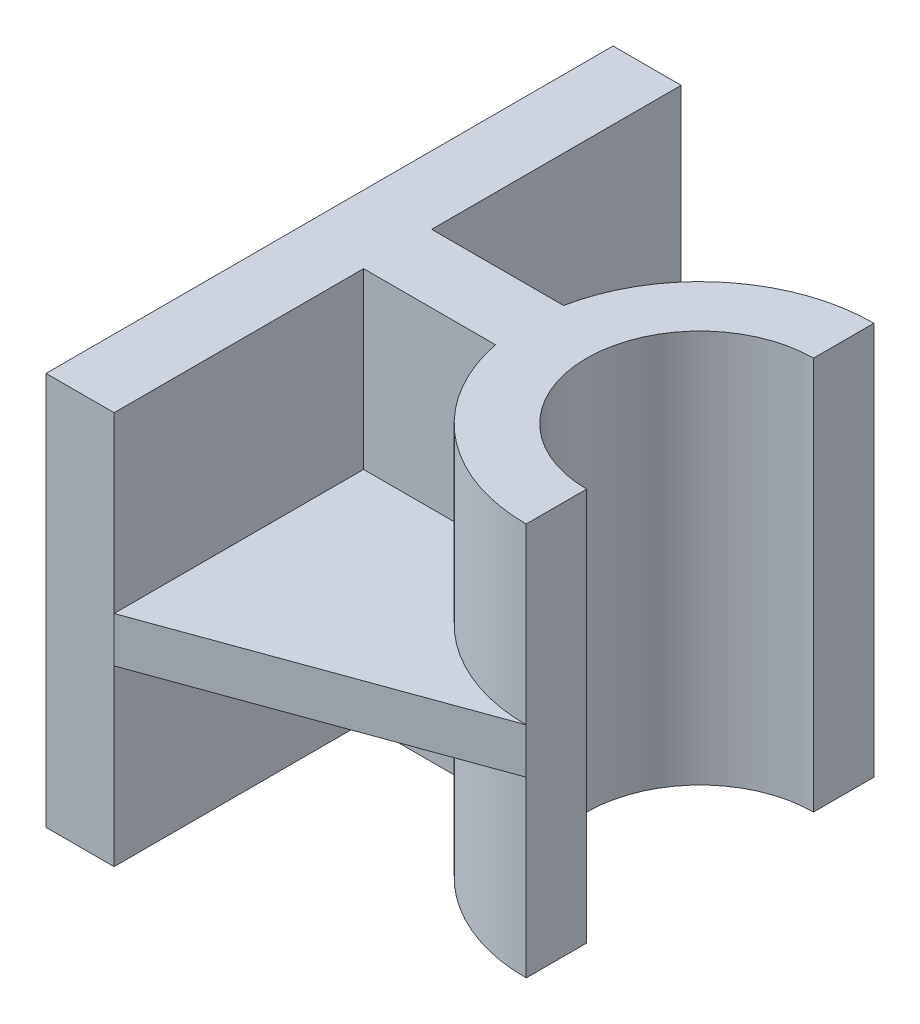
ISO-10303-21;
HEADER;
FILE_DESCRIPTION(('STEP AP214'),'2;1');
FILE_NAME('part.step','',(''),(''),'','','');
FILE_SCHEMA(('AUTOMOTIVE_DESIGN { 1 0 10303 214 1 1 1 1 }'));
ENDSEC;
DATA;
#1=APPLICATION_CONTEXT('core data for automotive mechanical design processes');
#2=APPLICATION_PROTOCOL_DEFINITION('international standard','automotive_design',2000,#1);
#3=PRODUCT_CONTEXT('',#1,'mechanical');
#4=PRODUCT('Part','Part','',(#3));
#5=PRODUCT_RELATED_PRODUCT_CATEGORY('part','',(#4));
#6=PRODUCT_DEFINITION_FORMATION('','',#4);
#7=PRODUCT_DEFINITION_CONTEXT('part definition',#1,'design');
#8=PRODUCT_DEFINITION('design','',#6,#7);
#9=PRODUCT_DEFINITION_SHAPE('','',#8);
#10=(LENGTH_UNIT() NAMED_UNIT(*) SI_UNIT(.MILLI.,.METRE.));
#11=(NAMED_UNIT(*) PLANE_ANGLE_UNIT() SI_UNIT($,.RADIAN.));
#12=(NAMED_UNIT(*) SI_UNIT($,.STERADIAN.) SOLID_ANGLE_UNIT());
#13=UNCERTAINTY_MEASURE_WITH_UNIT(LENGTH_MEASURE(1.E-05),#10,'distance_accuracy_value','');
#14=(GEOMETRIC_REPRESENTATION_CONTEXT(3) GLOBAL_UNCERTAINTY_ASSIGNED_CONTEXT((#13)) GLOBAL_UNIT_ASSIGNED_CONTEXT((#10,
#11,#12)) REPRESENTATION_CONTEXT('',''));
#15=CARTESIAN_POINT('',(0.,0.,0.));
#16=DIRECTION('',(0.,0.,1.));
#17=DIRECTION('',(1.,0.,0.));
#18=AXIS2_PLACEMENT_3D('',#15,#16,#17);
#19=CARTESIAN_POINT('',(44.5,-26.,0.));
#20=DIRECTION('',(0.,1.,0.));
#21=DIRECTION('',(0.,0.,1.));
#22=AXIS2_PLACEMENT_3D('',#19,#20,#21);
#23=CYLINDRICAL_SURFACE('',#22,23.);
#24=CARTESIAN_POINT('',(44.5,-3.,0.));
#25=DIRECTION('',(0.,1.,0.));
#26=DIRECTION('',(0.,0.,1.));
#27=AXIS2_PLACEMENT_3D('',#24,#25,#26);
#28=CIRCLE('',#27,23.);
#29=CARTESIAN_POINT('',(21.9445128627201,-3.,4.5));
#30=VERTEX_POINT('',#29);
#31=CARTESIAN_POINT('',(44.5,-3.,23.));
#32=VERTEX_POINT('',#31);
#33=EDGE_CURVE('E186',#30,#32,#28,.T.);
#34=ORIENTED_EDGE('',*,*,#33,.F.);
#35=DIRECTION('',(0.,1.,0.));
#36=VECTOR('',#35,1.);
#37=CARTESIAN_POINT('',(21.9445128627201,-26.,4.5));
#38=LINE('',#37,#36);
#39=CARTESIAN_POINT('',(21.9445128627201,-26.,4.5));
#40=VERTEX_POINT('',#39);
#41=EDGE_CURVE('E266',#40,#30,#38,.T.);
#42=ORIENTED_EDGE('',*,*,#41,.F.);
#43=CARTESIAN_POINT('',(44.5,-26.,0.));
#44=DIRECTION('',(0.,1.,0.));
#45=DIRECTION('',(0.,0.,1.));
#46=AXIS2_PLACEMENT_3D('',#43,#44,#45);
#47=CIRCLE('',#46,23.);
#48=CARTESIAN_POINT('',(44.5,-26.,23.));
#49=VERTEX_POINT('',#48);
#50=EDGE_CURVE('E170',#49,#40,#47,.F.);
#51=ORIENTED_EDGE('',*,*,#50,.F.);
#52=DIRECTION('',(0.,1.,0.));
#53=VECTOR('',#52,1.);
#54=CARTESIAN_POINT('',(44.5,-26.,23.));
#55=LINE('',#54,#53);
#56=EDGE_CURVE('E262',#49,#32,#55,.T.);
#57=ORIENTED_EDGE('',*,*,#56,.T.);
#58=EDGE_LOOP('',(#34,#42,#51,#57));
#59=FACE_BOUND('',#58,.T.);
#60=ADVANCED_FACE('F33',(#59),#23,.T.);
#61=CARTESIAN_POINT('',(0.,-26.,4.5));
#62=DIRECTION('',(0.,0.,1.));
#63=DIRECTION('',(1.,0.,0.));
#64=AXIS2_PLACEMENT_3D('',#61,#62,#63);
#65=PLANE('',#64);
#66=ORIENTED_EDGE('',*,*,#41,.T.);
#67=DIRECTION('',(-1.,0.,0.));
#68=VECTOR('',#67,1.);
#69=CARTESIAN_POINT('',(0.,-3.,4.5));
#70=LINE('',#69,#68);
#71=CARTESIAN_POINT('',(4.5,-3.,4.5));
#72=VERTEX_POINT('',#71);
#73=EDGE_CURVE('E189',#30,#72,#70,.T.);
#74=ORIENTED_EDGE('',*,*,#73,.T.);
#75=DIRECTION('',(0.,1.,0.));
#76=VECTOR('',#75,1.);
#77=CARTESIAN_POINT('',(4.5,-26.,4.5));
#78=LINE('',#77,#76);
#79=CARTESIAN_POINT('',(4.5,-26.,4.5));
#80=VERTEX_POINT('',#79);
#81=EDGE_CURVE('E211',#80,#72,#78,.T.);
#82=ORIENTED_EDGE('',*,*,#81,.F.);
#83=DIRECTION('',(1.,0.,0.));
#84=VECTOR('',#83,1.);
#85=CARTESIAN_POINT('',(0.,-26.,4.5));
#86=LINE('',#85,#84);
#87=EDGE_CURVE('E166',#80,#40,#86,.T.);
#88=ORIENTED_EDGE('',*,*,#87,.T.);
#89=EDGE_LOOP('',(#66,#74,#82,#88));
#90=FACE_BOUND('',#89,.T.);
#91=ADVANCED_FACE('F297',(#90),#65,.T.);
#92=CARTESIAN_POINT('',(4.5,-26.,0.));
#93=DIRECTION('',(1.,0.,0.));
#94=DIRECTION('',(0.,0.,-1.));
#95=AXIS2_PLACEMENT_3D('',#92,#93,#94);
#96=PLANE('',#95);
#97=ORIENTED_EDGE('',*,*,#81,.T.);
#98=DIRECTION('',(0.,0.,1.));
#99=VECTOR('',#98,1.);
#100=CARTESIAN_POINT('',(4.5,-3.,0.));
#101=LINE('',#100,#99);
#102=CARTESIAN_POINT('',(4.5,-3.,37.5));
#103=VERTEX_POINT('',#102);
#104=EDGE_CURVE('E192',#72,#103,#101,.T.);
#105=ORIENTED_EDGE('',*,*,#104,.T.);
#106=DIRECTION('',(0.,1.,0.));
#107=VECTOR('',#106,1.);
#108=CARTESIAN_POINT('',(4.5,-26.,37.5));
#109=LINE('',#108,#107);
#110=CARTESIAN_POINT('',(4.5,-26.,37.5));
#111=VERTEX_POINT('',#110);
#112=EDGE_CURVE('E210',#111,#103,#109,.T.);
#113=ORIENTED_EDGE('',*,*,#112,.F.);
#114=DIRECTION('',(0.,0.,-1.));
#115=VECTOR('',#114,1.);
#116=CARTESIAN_POINT('',(4.5,-26.,0.));
#117=LINE('',#116,#115);
#118=EDGE_CURVE('E161',#111,#80,#117,.T.);
#119=ORIENTED_EDGE('',*,*,#118,.T.);
#120=EDGE_LOOP('',(#97,#105,#113,#119));
#121=FACE_BOUND('',#120,.T.);
#122=ADVANCED_FACE('F209',(#121),#96,.T.);
#123=CARTESIAN_POINT('',(-4.5,-26.,0.));
#124=DIRECTION('',(1.,0.,0.));
#125=DIRECTION('',(0.,0.,-1.));
#126=AXIS2_PLACEMENT_3D('',#123,#124,#125);
#127=PLANE('',#126);
#128=DIRECTION('',(0.,0.,-1.));
#129=VECTOR('',#128,1.);
#130=CARTESIAN_POINT('',(-4.5,26.,0.));
#131=LINE('',#130,#129);
#132=CARTESIAN_POINT('',(-4.5,26.,37.5));
#133=VERTEX_POINT('',#132);
#134=CARTESIAN_POINT('',(-4.5,26.,-37.5));
#135=VERTEX_POINT('',#134);
#136=EDGE_CURVE('E177',#133,#135,#131,.T.);
#137=ORIENTED_EDGE('',*,*,#136,.T.);
#138=DIRECTION('',(0.,1.,0.));
#139=VECTOR('',#138,1.);
#140=CARTESIAN_POINT('',(-4.5,-26.,-37.5));
#141=LINE('',#140,#139);
#142=CARTESIAN_POINT('',(-4.5,-26.,-37.5));
#143=VERTEX_POINT('',#142);
#144=EDGE_CURVE('E11',#143,#135,#141,.T.);
#145=ORIENTED_EDGE('',*,*,#144,.F.);
#146=DIRECTION('',(0.,0.,-1.));
#147=VECTOR('',#146,1.);
#148=CARTESIAN_POINT('',(-4.5,-26.,0.));
#149=LINE('',#148,#147);
#150=CARTESIAN_POINT('',(-4.5,-26.,37.5));
#151=VERTEX_POINT('',#150);
#152=EDGE_CURVE('E59',#151,#143,#149,.T.);
#153=ORIENTED_EDGE('',*,*,#152,.F.);
#154=DIRECTION('',(0.,1.,0.));
#155=VECTOR('',#154,1.);
#156=CARTESIAN_POINT('',(-4.5,-26.,37.5));
#157=LINE('',#156,#155);
#158=EDGE_CURVE('E37',#151,#133,#157,.T.);
#159=ORIENTED_EDGE('',*,*,#158,.T.);
#160=EDGE_LOOP('',(#137,#145,#153,#159));
#161=FACE_BOUND('',#160,.T.);
#162=ADVANCED_FACE('F35',(#161),#127,.F.);
#163=CARTESIAN_POINT('',(0.,-26.,-37.5));
#164=DIRECTION('',(0.,0.,-1.));
#165=DIRECTION('',(-1.,0.,0.));
#166=AXIS2_PLACEMENT_3D('',#163,#164,#165);
#167=PLANE('',#166);
#168=DIRECTION('',(-1.,0.,0.));
#169=VECTOR('',#168,1.);
#170=CARTESIAN_POINT('',(0.,26.,-37.5));
#171=LINE('',#170,#169);
#172=CARTESIAN_POINT('',(4.5,26.,-37.5));
#173=VERTEX_POINT('',#172);
#174=EDGE_CURVE('E171',#173,#135,#171,.T.);
#175=ORIENTED_EDGE('',*,*,#174,.F.);
#176=DIRECTION('',(0.,1.,0.));
#177=VECTOR('',#176,1.);
#178=CARTESIAN_POINT('',(4.5,-26.,-37.5));
#179=LINE('',#178,#177);
#180=CARTESIAN_POINT('',(4.5,-26.,-37.5));
#181=VERTEX_POINT('',#180);
#182=EDGE_CURVE('E42',#181,#173,#179,.T.);
#183=ORIENTED_EDGE('',*,*,#182,.F.);
#184=DIRECTION('',(-1.,0.,0.));
#185=VECTOR('',#184,1.);
#186=CARTESIAN_POINT('',(0.,-26.,-37.5));
#187=LINE('',#186,#185);
#188=EDGE_CURVE('E159',#181,#143,#187,.T.);
#189=ORIENTED_EDGE('',*,*,#188,.T.);
#190=ORIENTED_EDGE('',*,*,#144,.T.);
#191=EDGE_LOOP('',(#175,#183,#189,#190));
#192=FACE_BOUND('',#191,.T.);
#193=ADVANCED_FACE('F348',(#192),#167,.T.);
#194=DIRECTION('',(0.,0.,-1.));
#195=VECTOR('',#194,1.);
#196=CARTESIAN_POINT('',(4.5,26.,0.));
#197=LINE('',#196,#195);
#198=CARTESIAN_POINT('',(4.5,26.,-4.5));
#199=VERTEX_POINT('',#198);
#200=EDGE_CURVE('E146',#199,#173,#197,.T.);
#201=ORIENTED_EDGE('',*,*,#200,.F.);
#202=DIRECTION('',(0.,1.,0.));
#203=VECTOR('',#202,1.);
#204=CARTESIAN_POINT('',(4.5,-26.,-4.5));
#205=LINE('',#204,#203);
#206=CARTESIAN_POINT('',(4.5,-26.,-4.5));
#207=VERTEX_POINT('',#206);
#208=EDGE_CURVE('E140',#207,#199,#205,.T.);
#209=ORIENTED_EDGE('',*,*,#208,.F.);
#210=EDGE_CURVE('E144',#207,#181,#117,.T.);
#211=ORIENTED_EDGE('',*,*,#210,.T.);
#212=ORIENTED_EDGE('',*,*,#182,.T.);
#213=EDGE_LOOP('',(#201,#209,#211,#212));
#214=FACE_BOUND('',#213,.T.);
#215=ADVANCED_FACE('F142',(#214),#96,.T.);
#216=CARTESIAN_POINT('',(0.,-26.,-4.5));
#217=DIRECTION('',(0.,0.,1.));
#218=DIRECTION('',(1.,0.,0.));
#219=AXIS2_PLACEMENT_3D('',#216,#217,#218);
#220=PLANE('',#219);
#221=DIRECTION('',(1.,0.,0.));
#222=VECTOR('',#221,1.);
#223=CARTESIAN_POINT('',(0.,26.,-4.5));
#224=LINE('',#223,#222);
#225=CARTESIAN_POINT('',(21.9445128627201,26.,-4.5));
#226=VERTEX_POINT('',#225);
#227=EDGE_CURVE('E251',#199,#226,#224,.T.);
#228=ORIENTED_EDGE('',*,*,#227,.T.);
#229=DIRECTION('',(0.,1.,0.));
#230=VECTOR('',#229,1.);
#231=CARTESIAN_POINT('',(21.9445128627201,-26.,-4.5));
#232=LINE('',#231,#230);
#233=CARTESIAN_POINT('',(21.9445128627201,-26.,-4.5));
#234=VERTEX_POINT('',#233);
#235=EDGE_CURVE('E150',#234,#226,#232,.T.);
#236=ORIENTED_EDGE('',*,*,#235,.F.);
#237=DIRECTION('',(1.,0.,0.));
#238=VECTOR('',#237,1.);
#239=CARTESIAN_POINT('',(0.,-26.,-4.5));
#240=LINE('',#239,#238);
#241=EDGE_CURVE('E153',#207,#234,#240,.T.);
#242=ORIENTED_EDGE('',*,*,#241,.F.);
#243=ORIENTED_EDGE('',*,*,#208,.T.);
#244=EDGE_LOOP('',(#228,#236,#242,#243));
#245=FACE_BOUND('',#244,.T.);
#246=ADVANCED_FACE('F154',(#245),#220,.F.);
#247=CARTESIAN_POINT('',(44.5,26.,0.));
#248=DIRECTION('',(0.,1.,0.));
#249=DIRECTION('',(0.,0.,1.));
#250=AXIS2_PLACEMENT_3D('',#247,#248,#249);
#251=CIRCLE('',#250,23.);
#252=CARTESIAN_POINT('',(44.5,26.,-23.));
#253=VERTEX_POINT('',#252);
#254=EDGE_CURVE('E242',#226,#253,#251,.F.);
#255=ORIENTED_EDGE('',*,*,#254,.T.);
#256=DIRECTION('',(0.,1.,0.));
#257=VECTOR('',#256,1.);
#258=CARTESIAN_POINT('',(44.5,-26.,-23.));
#259=LINE('',#258,#257);
#260=CARTESIAN_POINT('',(44.5,-26.,-23.));
#261=VERTEX_POINT('',#260);
#262=EDGE_CURVE('E256',#261,#253,#259,.T.);
#263=ORIENTED_EDGE('',*,*,#262,.F.);
#264=EDGE_CURVE('E156',#234,#261,#47,.F.);
#265=ORIENTED_EDGE('',*,*,#264,.F.);
#266=ORIENTED_EDGE('',*,*,#235,.T.);
#267=EDGE_LOOP('',(#255,#263,#265,#266));
#268=FACE_BOUND('',#267,.T.);
#269=ADVANCED_FACE('F329',(#268),#23,.T.);
#270=CARTESIAN_POINT('',(44.5,-26.,0.));
#271=DIRECTION('',(-1.,0.,0.));
#272=DIRECTION('',(0.,0.,1.));
#273=AXIS2_PLACEMENT_3D('',#270,#271,#272);
#274=PLANE('',#273);
#275=DIRECTION('',(0.,0.,1.));
#276=VECTOR('',#275,1.);
#277=CARTESIAN_POINT('',(44.5,26.,0.));
#278=LINE('',#277,#276);
#279=CARTESIAN_POINT('',(44.5,26.,-15.));
#280=VERTEX_POINT('',#279);
#281=EDGE_CURVE('E248',#253,#280,#278,.T.);
#282=ORIENTED_EDGE('',*,*,#281,.T.);
#283=DIRECTION('',(0.,1.,0.));
#284=VECTOR('',#283,1.);
#285=CARTESIAN_POINT('',(44.5,-26.,-15.));
#286=LINE('',#285,#284);
#287=CARTESIAN_POINT('',(44.5,-26.,-15.));
#288=VERTEX_POINT('',#287);
#289=EDGE_CURVE('E258',#288,#280,#286,.T.);
#290=ORIENTED_EDGE('',*,*,#289,.F.);
#291=DIRECTION('',(0.,0.,1.));
#292=VECTOR('',#291,1.);
#293=CARTESIAN_POINT('',(44.5,-26.,0.));
#294=LINE('',#293,#292);
#295=EDGE_CURVE('E305',#261,#288,#294,.T.);
#296=ORIENTED_EDGE('',*,*,#295,.F.);
#297=ORIENTED_EDGE('',*,*,#262,.T.);
#298=EDGE_LOOP('',(#282,#290,#296,#297));
#299=FACE_BOUND('',#298,.T.);
#300=ADVANCED_FACE('F338',(#299),#274,.F.);
#301=CARTESIAN_POINT('',(44.5,-26.,0.));
#302=DIRECTION('',(0.,1.,0.));
#303=DIRECTION('',(0.,0.,1.));
#304=AXIS2_PLACEMENT_3D('',#301,#302,#303);
#305=CYLINDRICAL_SURFACE('',#304,15.);
#306=CARTESIAN_POINT('',(44.5,26.,0.));
#307=DIRECTION('',(0.,1.,0.));
#308=DIRECTION('',(0.,0.,1.));
#309=AXIS2_PLACEMENT_3D('',#306,#307,#308);
#310=CIRCLE('',#309,15.);
#311=CARTESIAN_POINT('',(44.5,26.,15.));
#312=VERTEX_POINT('',#311);
#313=EDGE_CURVE('E245',#312,#280,#310,.F.);
#314=ORIENTED_EDGE('',*,*,#313,.F.);
#315=DIRECTION('',(0.,1.,0.));
#316=VECTOR('',#315,1.);
#317=CARTESIAN_POINT('',(44.5,-26.,15.));
#318=LINE('',#317,#316);
#319=CARTESIAN_POINT('',(44.5,-26.,15.));
#320=VERTEX_POINT('',#319);
#321=EDGE_CURVE('E260',#320,#312,#318,.T.);
#322=ORIENTED_EDGE('',*,*,#321,.F.);
#323=CARTESIAN_POINT('',(44.5,-26.,0.));
#324=DIRECTION('',(0.,1.,0.));
#325=DIRECTION('',(0.,0.,1.));
#326=AXIS2_PLACEMENT_3D('',#323,#324,#325);
#327=CIRCLE('',#326,15.);
#328=EDGE_CURVE('E303',#320,#288,#327,.F.);
#329=ORIENTED_EDGE('',*,*,#328,.T.);
#330=ORIENTED_EDGE('',*,*,#289,.T.);
#331=EDGE_LOOP('',(#314,#322,#329,#330));
#332=FACE_BOUND('',#331,.T.);
#333=ADVANCED_FACE('F314',(#332),#305,.F.);
#334=CARTESIAN_POINT('',(44.5,-26.,0.));
#335=DIRECTION('',(-1.,0.,0.));
#336=DIRECTION('',(0.,0.,1.));
#337=AXIS2_PLACEMENT_3D('',#334,#335,#336);
#338=PLANE('',#337);
#339=CARTESIAN_POINT('',(44.5,3.,23.));
#340=VERTEX_POINT('',#339);
#341=CARTESIAN_POINT('',(44.5,26.,23.));
#342=VERTEX_POINT('',#341);
#343=EDGE_CURVE('E265',#340,#342,#55,.T.);
#344=ORIENTED_EDGE('',*,*,#343,.F.);
#345=DIRECTION('',(0.,1.,0.));
#346=VECTOR('',#345,1.);
#347=CARTESIAN_POINT('',(44.5,-26.,23.));
#348=LINE('',#347,#346);
#349=EDGE_CURVE('E174',#340,#32,#348,.F.);
#350=ORIENTED_EDGE('',*,*,#349,.T.);
#351=ORIENTED_EDGE('',*,*,#56,.F.);
#352=DIRECTION('',(0.,0.,1.));
#353=VECTOR('',#352,1.);
#354=CARTESIAN_POINT('',(44.5,-26.,0.));
#355=LINE('',#354,#353);
#356=EDGE_CURVE('E301',#320,#49,#355,.T.);
#357=ORIENTED_EDGE('',*,*,#356,.F.);
#358=ORIENTED_EDGE('',*,*,#321,.T.);
#359=DIRECTION('',(0.,0.,1.));
#360=VECTOR('',#359,1.);
#361=CARTESIAN_POINT('',(44.5,26.,0.));
#362=LINE('',#361,#360);
#363=EDGE_CURVE('E241',#312,#342,#362,.T.);
#364=ORIENTED_EDGE('',*,*,#363,.T.);
#365=EDGE_LOOP('',(#344,#350,#351,#357,#358,#364));
#366=FACE_BOUND('',#365,.T.);
#367=ADVANCED_FACE('F316',(#366),#338,.F.);
#368=CARTESIAN_POINT('',(21.9445128627201,3.,4.5));
#369=VERTEX_POINT('',#368);
#370=CARTESIAN_POINT('',(21.9445128627201,26.,4.5));
#371=VERTEX_POINT('',#370);
#372=EDGE_CURVE('E268',#369,#371,#38,.T.);
#373=ORIENTED_EDGE('',*,*,#372,.F.);
#374=CARTESIAN_POINT('',(44.5,3.,0.));
#375=DIRECTION('',(0.,1.,0.));
#376=DIRECTION('',(0.,0.,1.));
#377=AXIS2_PLACEMENT_3D('',#374,#375,#376);
#378=CIRCLE('',#377,23.);
#379=EDGE_CURVE('E178',#369,#340,#378,.T.);
#380=ORIENTED_EDGE('',*,*,#379,.T.);
#381=ORIENTED_EDGE('',*,*,#343,.T.);
#382=EDGE_CURVE('E238',#342,#371,#251,.F.);
#383=ORIENTED_EDGE('',*,*,#382,.T.);
#384=EDGE_LOOP('',(#373,#380,#381,#383));
#385=FACE_BOUND('',#384,.T.);
#386=ADVANCED_FACE('F277',(#385),#23,.T.);
#387=DIRECTION('',(-1.,0.,0.));
#388=VECTOR('',#387,1.);
#389=CARTESIAN_POINT('',(0.,3.,4.5));
#390=LINE('',#389,#388);
#391=CARTESIAN_POINT('',(4.5,3.,4.5));
#392=VERTEX_POINT('',#391);
#393=EDGE_CURVE('E181',#369,#392,#390,.T.);
#394=ORIENTED_EDGE('',*,*,#393,.F.);
#395=ORIENTED_EDGE('',*,*,#372,.T.);
#396=DIRECTION('',(1.,0.,0.));
#397=VECTOR('',#396,1.);
#398=CARTESIAN_POINT('',(0.,26.,4.5));
#399=LINE('',#398,#397);
#400=CARTESIAN_POINT('',(4.5,26.,4.5));
#401=VERTEX_POINT('',#400);
#402=EDGE_CURVE('E235',#401,#371,#399,.T.);
#403=ORIENTED_EDGE('',*,*,#402,.F.);
#404=EDGE_CURVE('E217',#392,#401,#78,.T.);
#405=ORIENTED_EDGE('',*,*,#404,.F.);
#406=EDGE_LOOP('',(#394,#395,#403,#405));
#407=FACE_BOUND('',#406,.T.);
#408=ADVANCED_FACE('F273',(#407),#65,.T.);
#409=DIRECTION('',(0.,0.,1.));
#410=VECTOR('',#409,1.);
#411=CARTESIAN_POINT('',(4.5,3.,0.));
#412=LINE('',#411,#410);
#413=CARTESIAN_POINT('',(4.5,2.99999999999999,37.5));
#414=VERTEX_POINT('',#413);
#415=EDGE_CURVE('E184',#392,#414,#412,.T.);
#416=ORIENTED_EDGE('',*,*,#415,.F.);
#417=ORIENTED_EDGE('',*,*,#404,.T.);
#418=CARTESIAN_POINT('',(4.5,26.,37.5));
#419=VERTEX_POINT('',#418);
#420=EDGE_CURVE('E229',#419,#401,#197,.T.);
#421=ORIENTED_EDGE('',*,*,#420,.F.);
#422=EDGE_CURVE('E218',#414,#419,#109,.T.);
#423=ORIENTED_EDGE('',*,*,#422,.F.);
#424=EDGE_LOOP('',(#416,#417,#421,#423));
#425=FACE_BOUND('',#424,.T.);
#426=ADVANCED_FACE('F282',(#425),#96,.T.);
#427=CARTESIAN_POINT('',(0.,-26.,37.5));
#428=DIRECTION('',(0.,0.,-1.));
#429=DIRECTION('',(-1.,0.,0.));
#430=AXIS2_PLACEMENT_3D('',#427,#428,#429);
#431=PLANE('',#430);
#432=DIRECTION('',(-1.,0.,0.));
#433=VECTOR('',#432,1.);
#434=CARTESIAN_POINT('',(0.,26.,37.5));
#435=LINE('',#434,#433);
#436=EDGE_CURVE('E225',#419,#133,#435,.T.);
#437=ORIENTED_EDGE('',*,*,#436,.T.);
#438=ORIENTED_EDGE('',*,*,#158,.F.);
#439=DIRECTION('',(-1.,0.,0.));
#440=VECTOR('',#439,1.);
#441=CARTESIAN_POINT('',(0.,-26.,37.5));
#442=LINE('',#441,#440);
#443=EDGE_CURVE('E109',#111,#151,#442,.T.);
#444=ORIENTED_EDGE('',*,*,#443,.F.);
#445=ORIENTED_EDGE('',*,*,#112,.T.);
#446=EDGE_CURVE('E216',#103,#414,#109,.T.);
#447=ORIENTED_EDGE('',*,*,#446,.T.);
#448=ORIENTED_EDGE('',*,*,#422,.T.);
#449=EDGE_LOOP('',(#437,#438,#444,#445,#447,#448));
#450=FACE_BOUND('',#449,.T.);
#451=ADVANCED_FACE('F215',(#450),#431,.F.);
#452=CARTESIAN_POINT('',(0.,-26.,0.));
#453=DIRECTION('',(0.,1.,0.));
#454=DIRECTION('',(0.,0.,1.));
#455=AXIS2_PLACEMENT_3D('',#452,#453,#454);
#456=PLANE('',#455);
#457=ORIENTED_EDGE('',*,*,#152,.T.);
#458=ORIENTED_EDGE('',*,*,#188,.F.);
#459=ORIENTED_EDGE('',*,*,#210,.F.);
#460=ORIENTED_EDGE('',*,*,#241,.T.);
#461=ORIENTED_EDGE('',*,*,#264,.T.);
#462=ORIENTED_EDGE('',*,*,#295,.T.);
#463=ORIENTED_EDGE('',*,*,#328,.F.);
#464=ORIENTED_EDGE('',*,*,#356,.T.);
#465=ORIENTED_EDGE('',*,*,#50,.T.);
#466=ORIENTED_EDGE('',*,*,#87,.F.);
#467=ORIENTED_EDGE('',*,*,#118,.F.);
#468=ORIENTED_EDGE('',*,*,#443,.T.);
#469=EDGE_LOOP('',(#457,#458,#459,#460,#461,#462,#463,#464,#465,#466,#467,#468));
#470=FACE_BOUND('',#469,.T.);
#471=ADVANCED_FACE('F158',(#470),#456,.F.);
#472=CARTESIAN_POINT('',(0.,26.,0.));
#473=DIRECTION('',(0.,1.,0.));
#474=DIRECTION('',(0.,0.,1.));
#475=AXIS2_PLACEMENT_3D('',#472,#473,#474);
#476=PLANE('',#475);
#477=ORIENTED_EDGE('',*,*,#136,.F.);
#478=ORIENTED_EDGE('',*,*,#436,.F.);
#479=ORIENTED_EDGE('',*,*,#420,.T.);
#480=ORIENTED_EDGE('',*,*,#402,.T.);
#481=ORIENTED_EDGE('',*,*,#382,.F.);
#482=ORIENTED_EDGE('',*,*,#363,.F.);
#483=ORIENTED_EDGE('',*,*,#313,.T.);
#484=ORIENTED_EDGE('',*,*,#281,.F.);
#485=ORIENTED_EDGE('',*,*,#254,.F.);
#486=ORIENTED_EDGE('',*,*,#227,.F.);
#487=ORIENTED_EDGE('',*,*,#200,.T.);
#488=ORIENTED_EDGE('',*,*,#174,.T.);
#489=EDGE_LOOP('',(#477,#478,#479,#480,#481,#482,#483,#484,#485,#486,#487,#488));
#490=FACE_BOUND('',#489,.T.);
#491=ADVANCED_FACE('F231',(#490),#476,.T.);
#492=CARTESIAN_POINT('',(44.5,0.,23.));
#493=DIRECTION('',(-0.3407993236214,0.,-0.940136065162483));
#494=DIRECTION('',(-0.940136065162483,0.,0.3407993236214));
#495=AXIS2_PLACEMENT_3D('',#492,#493,#494);
#496=PLANE('',#495);
#497=ORIENTED_EDGE('',*,*,#349,.F.);
#498=DIRECTION('',(-0.940136065162483,0.,0.3407993236214));
#499=VECTOR('',#498,1.);
#500=CARTESIAN_POINT('',(44.5,3.,23.));
#501=LINE('',#500,#499);
#502=EDGE_CURVE('E50',#340,#414,#501,.T.);
#503=ORIENTED_EDGE('',*,*,#502,.T.);
#504=ORIENTED_EDGE('',*,*,#446,.F.);
#505=DIRECTION('',(-0.940136065162483,0.,0.3407993236214));
#506=VECTOR('',#505,1.);
#507=CARTESIAN_POINT('',(44.5,-3.,23.));
#508=LINE('',#507,#506);
#509=EDGE_CURVE('E195',#32,#103,#508,.T.);
#510=ORIENTED_EDGE('',*,*,#509,.F.);
#511=EDGE_LOOP('',(#497,#503,#504,#510));
#512=FACE_BOUND('',#511,.T.);
#513=ADVANCED_FACE('F317',(#512),#496,.F.);
#514=CARTESIAN_POINT('',(20.,3.,0.));
#515=DIRECTION('',(0.,1.,0.));
#516=DIRECTION('',(0.,0.,1.));
#517=AXIS2_PLACEMENT_3D('',#514,#515,#516);
#518=PLANE('',#517);
#519=ORIENTED_EDGE('',*,*,#379,.F.);
#520=ORIENTED_EDGE('',*,*,#393,.T.);
#521=ORIENTED_EDGE('',*,*,#415,.T.);
#522=ORIENTED_EDGE('',*,*,#502,.F.);
#523=EDGE_LOOP('',(#519,#520,#521,#522));
#524=FACE_BOUND('',#523,.T.);
#525=ADVANCED_FACE('F318',(#524),#518,.T.);
#526=CARTESIAN_POINT('',(20.,-3.,0.));
#527=DIRECTION('',(0.,1.,0.));
#528=DIRECTION('',(0.,0.,1.));
#529=AXIS2_PLACEMENT_3D('',#526,#527,#528);
#530=PLANE('',#529);
#531=ORIENTED_EDGE('',*,*,#73,.F.);
#532=ORIENTED_EDGE('',*,*,#33,.T.);
#533=ORIENTED_EDGE('',*,*,#509,.T.);
#534=ORIENTED_EDGE('',*,*,#104,.F.);
#535=EDGE_LOOP('',(#531,#532,#533,#534));
#536=FACE_BOUND('',#535,.T.);
#537=ADVANCED_FACE('F203',(#536),#530,.F.);
#538=CLOSED_SHELL('',(#60,#91,#122,#162,#193,#215,#246,#269,#300,#333,#367,#386,#408,#426,#451,
#471,#491,#513,#525,#537));
#539=MANIFOLD_SOLID_BREP('B2',#538);
#540=ADVANCED_BREP_SHAPE_REPRESENTATION('',(#18,#539),#14);
#541=SHAPE_DEFINITION_REPRESENTATION(#9,#540);
ENDSEC;
END-ISO-10303-21;
